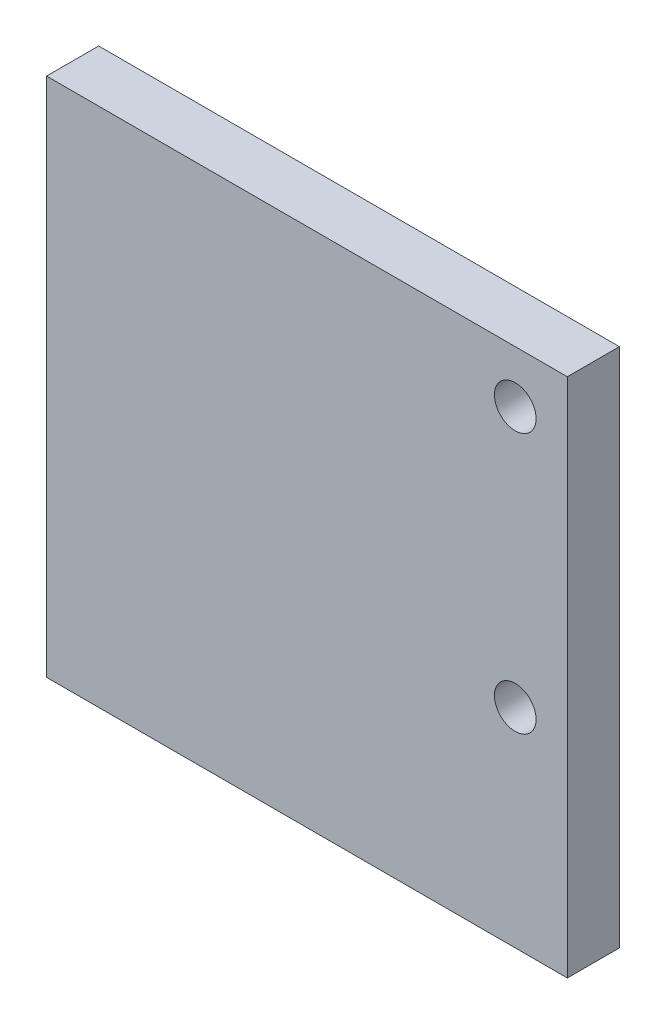
ISO-10303-21;
HEADER;
FILE_DESCRIPTION(('STEP AP214'),'2;1');
FILE_NAME('part.step','',(''),(''),'','','');
FILE_SCHEMA(('AUTOMOTIVE_DESIGN { 1 0 10303 214 1 1 1 1 }'));
ENDSEC;
DATA;
#1=APPLICATION_CONTEXT('core data for automotive mechanical design processes');
#2=APPLICATION_PROTOCOL_DEFINITION('international standard','automotive_design',2000,#1);
#3=PRODUCT_CONTEXT('',#1,'mechanical');
#4=PRODUCT('Part','Part','',(#3));
#5=PRODUCT_RELATED_PRODUCT_CATEGORY('part','',(#4));
#6=PRODUCT_DEFINITION_FORMATION('','',#4);
#7=PRODUCT_DEFINITION_CONTEXT('part definition',#1,'design');
#8=PRODUCT_DEFINITION('design','',#6,#7);
#9=PRODUCT_DEFINITION_SHAPE('','',#8);
#10=(LENGTH_UNIT() NAMED_UNIT(*) SI_UNIT(.MILLI.,.METRE.));
#11=(NAMED_UNIT(*) PLANE_ANGLE_UNIT() SI_UNIT($,.RADIAN.));
#12=(NAMED_UNIT(*) SI_UNIT($,.STERADIAN.) SOLID_ANGLE_UNIT());
#13=UNCERTAINTY_MEASURE_WITH_UNIT(LENGTH_MEASURE(1.E-05),#10,'distance_accuracy_value','');
#14=(GEOMETRIC_REPRESENTATION_CONTEXT(3) GLOBAL_UNCERTAINTY_ASSIGNED_CONTEXT((#13)) GLOBAL_UNIT_ASSIGNED_CONTEXT((#10,
#11,#12)) REPRESENTATION_CONTEXT('',''));
#15=CARTESIAN_POINT('',(0.,0.,0.));
#16=DIRECTION('',(0.,0.,1.));
#17=DIRECTION('',(1.,0.,0.));
#18=AXIS2_PLACEMENT_3D('',#15,#16,#17);
#19=CARTESIAN_POINT('',(0.,0.,10.));
#20=DIRECTION('',(1.,0.,0.));
#21=DIRECTION('',(0.,1.,0.));
#22=AXIS2_PLACEMENT_3D('',#19,#20,#21);
#23=PLANE('',#22);
#24=DIRECTION('',(0.,-1.,0.));
#25=VECTOR('',#24,1.);
#26=CARTESIAN_POINT('',(0.,0.,0.));
#27=LINE('',#26,#25);
#28=CARTESIAN_POINT('',(0.,100.,0.));
#29=VERTEX_POINT('',#28);
#30=CARTESIAN_POINT('',(0.,0.,0.));
#31=VERTEX_POINT('',#30);
#32=EDGE_CURVE('E95',#29,#31,#27,.T.);
#33=ORIENTED_EDGE('',*,*,#32,.T.);
#34=DIRECTION('',(0.,0.,-1.));
#35=VECTOR('',#34,1.);
#36=CARTESIAN_POINT('',(0.,0.,10.));
#37=LINE('',#36,#35);
#38=CARTESIAN_POINT('',(0.,0.,10.));
#39=VERTEX_POINT('',#38);
#40=EDGE_CURVE('E11',#39,#31,#37,.T.);
#41=ORIENTED_EDGE('',*,*,#40,.F.);
#42=DIRECTION('',(0.,-1.,0.));
#43=VECTOR('',#42,1.);
#44=CARTESIAN_POINT('',(0.,0.,10.));
#45=LINE('',#44,#43);
#46=CARTESIAN_POINT('',(0.,100.,10.));
#47=VERTEX_POINT('',#46);
#48=EDGE_CURVE('E83',#47,#39,#45,.T.);
#49=ORIENTED_EDGE('',*,*,#48,.F.);
#50=DIRECTION('',(0.,0.,-1.));
#51=VECTOR('',#50,1.);
#52=CARTESIAN_POINT('',(0.,100.,10.));
#53=LINE('',#52,#51);
#54=EDGE_CURVE('E91',#47,#29,#53,.T.);
#55=ORIENTED_EDGE('',*,*,#54,.T.);
#56=EDGE_LOOP('',(#33,#41,#49,#55));
#57=FACE_BOUND('',#56,.T.);
#58=ADVANCED_FACE('F32',(#57),#23,.F.);
#59=CARTESIAN_POINT('',(0.,0.,10.));
#60=DIRECTION('',(0.,1.,0.));
#61=DIRECTION('',(0.,0.,1.));
#62=AXIS2_PLACEMENT_3D('',#59,#60,#61);
#63=PLANE('',#62);
#64=CARTESIAN_POINT('',(25.,0.,5.));
#65=DIRECTION('',(0.,-1.,0.));
#66=DIRECTION('',(0.,0.,-1.));
#67=AXIS2_PLACEMENT_3D('',#64,#65,#66);
#68=CIRCLE('',#67,2.5);
#69=CARTESIAN_POINT('',(25.,0.,2.5));
#70=VERTEX_POINT('',#69);
#71=EDGE_CURVE('E122',#70,#70,#68,.T.);
#72=ORIENTED_EDGE('',*,*,#71,.F.);
#73=EDGE_LOOP('',(#72));
#74=FACE_BOUND('',#73,.T.);
#75=CARTESIAN_POINT('',(50.,0.,5.));
#76=DIRECTION('',(0.,-1.,0.));
#77=DIRECTION('',(0.,0.,-1.));
#78=AXIS2_PLACEMENT_3D('',#75,#76,#77);
#79=CIRCLE('',#78,2.5);
#80=CARTESIAN_POINT('',(50.,0.,2.5));
#81=VERTEX_POINT('',#80);
#82=EDGE_CURVE('E116',#81,#81,#79,.T.);
#83=ORIENTED_EDGE('',*,*,#82,.F.);
#84=EDGE_LOOP('',(#83));
#85=FACE_BOUND('',#84,.T.);
#86=CARTESIAN_POINT('',(75.,0.,5.));
#87=DIRECTION('',(0.,-1.,0.));
#88=DIRECTION('',(0.,0.,-1.));
#89=AXIS2_PLACEMENT_3D('',#86,#87,#88);
#90=CIRCLE('',#89,2.5);
#91=CARTESIAN_POINT('',(75.,0.,2.5));
#92=VERTEX_POINT('',#91);
#93=EDGE_CURVE('E109',#92,#92,#90,.T.);
#94=ORIENTED_EDGE('',*,*,#93,.F.);
#95=EDGE_LOOP('',(#94));
#96=FACE_BOUND('',#95,.T.);
#97=DIRECTION('',(1.,0.,0.));
#98=VECTOR('',#97,1.);
#99=CARTESIAN_POINT('',(0.,0.,0.));
#100=LINE('',#99,#98);
#101=CARTESIAN_POINT('',(100.,0.,0.));
#102=VERTEX_POINT('',#101);
#103=EDGE_CURVE('E87',#31,#102,#100,.T.);
#104=ORIENTED_EDGE('',*,*,#103,.T.);
#105=DIRECTION('',(0.,0.,-1.));
#106=VECTOR('',#105,1.);
#107=CARTESIAN_POINT('',(100.,0.,10.));
#108=LINE('',#107,#106);
#109=CARTESIAN_POINT('',(100.,0.,10.));
#110=VERTEX_POINT('',#109);
#111=EDGE_CURVE('E40',#110,#102,#108,.T.);
#112=ORIENTED_EDGE('',*,*,#111,.F.);
#113=DIRECTION('',(1.,0.,0.));
#114=VECTOR('',#113,1.);
#115=CARTESIAN_POINT('',(0.,0.,10.));
#116=LINE('',#115,#114);
#117=EDGE_CURVE('E78',#39,#110,#116,.T.);
#118=ORIENTED_EDGE('',*,*,#117,.F.);
#119=ORIENTED_EDGE('',*,*,#40,.T.);
#120=EDGE_LOOP('',(#104,#112,#118,#119));
#121=FACE_BOUND('',#120,.T.);
#122=ADVANCED_FACE('F86',(#74,#85,#96,#121),#63,.F.);
#123=CARTESIAN_POINT('',(100.,0.,10.));
#124=DIRECTION('',(-1.,0.,0.));
#125=DIRECTION('',(0.,-1.,0.));
#126=AXIS2_PLACEMENT_3D('',#123,#124,#125);
#127=PLANE('',#126);
#128=DIRECTION('',(0.,1.,0.));
#129=VECTOR('',#128,1.);
#130=CARTESIAN_POINT('',(100.,0.,0.));
#131=LINE('',#130,#129);
#132=CARTESIAN_POINT('',(100.,100.,0.));
#133=VERTEX_POINT('',#132);
#134=EDGE_CURVE('E65',#102,#133,#131,.T.);
#135=ORIENTED_EDGE('',*,*,#134,.T.);
#136=DIRECTION('',(0.,0.,-1.));
#137=VECTOR('',#136,1.);
#138=CARTESIAN_POINT('',(100.,100.,10.));
#139=LINE('',#138,#137);
#140=CARTESIAN_POINT('',(100.,100.,10.));
#141=VERTEX_POINT('',#140);
#142=EDGE_CURVE('E88',#141,#133,#139,.T.);
#143=ORIENTED_EDGE('',*,*,#142,.F.);
#144=DIRECTION('',(0.,1.,0.));
#145=VECTOR('',#144,1.);
#146=CARTESIAN_POINT('',(100.,0.,10.));
#147=LINE('',#146,#145);
#148=EDGE_CURVE('E81',#110,#141,#147,.T.);
#149=ORIENTED_EDGE('',*,*,#148,.F.);
#150=ORIENTED_EDGE('',*,*,#111,.T.);
#151=EDGE_LOOP('',(#135,#143,#149,#150));
#152=FACE_BOUND('',#151,.T.);
#153=ADVANCED_FACE('F89',(#152),#127,.F.);
#154=CARTESIAN_POINT('',(0.,100.,10.));
#155=DIRECTION('',(0.,-1.,0.));
#156=DIRECTION('',(0.,0.,-1.));
#157=AXIS2_PLACEMENT_3D('',#154,#155,#156);
#158=PLANE('',#157);
#159=DIRECTION('',(-1.,0.,0.));
#160=VECTOR('',#159,1.);
#161=CARTESIAN_POINT('',(0.,100.,0.));
#162=LINE('',#161,#160);
#163=EDGE_CURVE('E71',#133,#29,#162,.T.);
#164=ORIENTED_EDGE('',*,*,#163,.T.);
#165=ORIENTED_EDGE('',*,*,#54,.F.);
#166=DIRECTION('',(-1.,0.,0.));
#167=VECTOR('',#166,1.);
#168=CARTESIAN_POINT('',(0.,100.,10.));
#169=LINE('',#168,#167);
#170=EDGE_CURVE('E48',#141,#47,#169,.T.);
#171=ORIENTED_EDGE('',*,*,#170,.F.);
#172=ORIENTED_EDGE('',*,*,#142,.T.);
#173=EDGE_LOOP('',(#164,#165,#171,#172));
#174=FACE_BOUND('',#173,.T.);
#175=ADVANCED_FACE('F103',(#174),#158,.F.);
#176=CARTESIAN_POINT('',(0.,0.,10.));
#177=DIRECTION('',(0.,0.,-1.));
#178=DIRECTION('',(-1.,0.,0.));
#179=AXIS2_PLACEMENT_3D('',#176,#177,#178);
#180=PLANE('',#179);
#181=CARTESIAN_POINT('',(90.,90.,10.));
#182=DIRECTION('',(0.,0.,1.));
#183=DIRECTION('',(1.,0.,0.));
#184=AXIS2_PLACEMENT_3D('',#181,#182,#183);
#185=CIRCLE('',#184,4.00000000000001);
#186=CARTESIAN_POINT('',(94.,90.,10.));
#187=VERTEX_POINT('',#186);
#188=EDGE_CURVE('E133',#187,#187,#185,.T.);
#189=ORIENTED_EDGE('',*,*,#188,.F.);
#190=EDGE_LOOP('',(#189));
#191=FACE_BOUND('',#190,.T.);
#192=CARTESIAN_POINT('',(90.,40.,10.));
#193=DIRECTION('',(0.,0.,1.));
#194=DIRECTION('',(1.,0.,0.));
#195=AXIS2_PLACEMENT_3D('',#192,#193,#194);
#196=CIRCLE('',#195,4.00000000000001);
#197=CARTESIAN_POINT('',(94.,40.,10.));
#198=VERTEX_POINT('',#197);
#199=EDGE_CURVE('E127',#198,#198,#196,.T.);
#200=ORIENTED_EDGE('',*,*,#199,.F.);
#201=EDGE_LOOP('',(#200));
#202=FACE_BOUND('',#201,.T.);
#203=ORIENTED_EDGE('',*,*,#48,.T.);
#204=ORIENTED_EDGE('',*,*,#117,.T.);
#205=ORIENTED_EDGE('',*,*,#148,.T.);
#206=ORIENTED_EDGE('',*,*,#170,.T.);
#207=EDGE_LOOP('',(#203,#204,#205,#206));
#208=FACE_BOUND('',#207,.T.);
#209=ADVANCED_FACE('F79',(#191,#202,#208),#180,.F.);
#210=CARTESIAN_POINT('',(0.,0.,0.));
#211=DIRECTION('',(0.,0.,-1.));
#212=DIRECTION('',(-1.,0.,0.));
#213=AXIS2_PLACEMENT_3D('',#210,#211,#212);
#214=PLANE('',#213);
#215=CARTESIAN_POINT('',(90.,90.,0.));
#216=DIRECTION('',(0.,0.,1.));
#217=DIRECTION('',(1.,0.,0.));
#218=AXIS2_PLACEMENT_3D('',#215,#216,#217);
#219=CIRCLE('',#218,4.00000000000001);
#220=CARTESIAN_POINT('',(94.,90.,0.));
#221=VERTEX_POINT('',#220);
#222=EDGE_CURVE('E113',#221,#221,#219,.T.);
#223=ORIENTED_EDGE('',*,*,#222,.T.);
#224=EDGE_LOOP('',(#223));
#225=FACE_BOUND('',#224,.T.);
#226=CARTESIAN_POINT('',(90.,40.,0.));
#227=DIRECTION('',(0.,0.,1.));
#228=DIRECTION('',(1.,0.,0.));
#229=AXIS2_PLACEMENT_3D('',#226,#227,#228);
#230=CIRCLE('',#229,4.00000000000001);
#231=CARTESIAN_POINT('',(94.,40.,0.));
#232=VERTEX_POINT('',#231);
#233=EDGE_CURVE('E130',#232,#232,#230,.T.);
#234=ORIENTED_EDGE('',*,*,#233,.T.);
#235=EDGE_LOOP('',(#234));
#236=FACE_BOUND('',#235,.T.);
#237=ORIENTED_EDGE('',*,*,#32,.F.);
#238=ORIENTED_EDGE('',*,*,#163,.F.);
#239=ORIENTED_EDGE('',*,*,#134,.F.);
#240=ORIENTED_EDGE('',*,*,#103,.F.);
#241=EDGE_LOOP('',(#237,#238,#239,#240));
#242=FACE_BOUND('',#241,.T.);
#243=ADVANCED_FACE('F106',(#225,#236,#242),#214,.T.);
#244=CARTESIAN_POINT('',(75.,30.,5.));
#245=DIRECTION('',(0.,-1.,0.));
#246=DIRECTION('',(0.,0.,-1.));
#247=AXIS2_PLACEMENT_3D('',#244,#245,#246);
#248=CYLINDRICAL_SURFACE('',#247,2.5);
#249=CARTESIAN_POINT('',(75.,30.,5.));
#250=DIRECTION('',(0.,-1.,0.));
#251=DIRECTION('',(0.,0.,-1.));
#252=AXIS2_PLACEMENT_3D('',#249,#250,#251);
#253=CIRCLE('',#252,2.5);
#254=CARTESIAN_POINT('',(75.,30.,2.5));
#255=VERTEX_POINT('',#254);
#256=EDGE_CURVE('E112',#255,#255,#253,.T.);
#257=ORIENTED_EDGE('',*,*,#256,.F.);
#258=EDGE_LOOP('',(#257));
#259=FACE_BOUND('',#258,.T.);
#260=ORIENTED_EDGE('',*,*,#93,.T.);
#261=EDGE_LOOP('',(#260));
#262=FACE_BOUND('',#261,.T.);
#263=ADVANCED_FACE('F179',(#259,#262),#248,.F.);
#264=CARTESIAN_POINT('',(75.,30.,5.));
#265=DIRECTION('',(0.,-1.,0.));
#266=DIRECTION('',(0.,0.,-1.));
#267=AXIS2_PLACEMENT_3D('',#264,#265,#266);
#268=PLANE('',#267);
#269=ORIENTED_EDGE('',*,*,#256,.T.);
#270=EDGE_LOOP('',(#269));
#271=FACE_BOUND('',#270,.T.);
#272=ADVANCED_FACE('F183',(#271),#268,.T.);
#273=CARTESIAN_POINT('',(50.,30.,5.));
#274=DIRECTION('',(0.,-1.,0.));
#275=DIRECTION('',(0.,0.,-1.));
#276=AXIS2_PLACEMENT_3D('',#273,#274,#275);
#277=CYLINDRICAL_SURFACE('',#276,2.5);
#278=CARTESIAN_POINT('',(50.,30.,5.));
#279=DIRECTION('',(0.,-1.,0.));
#280=DIRECTION('',(0.,0.,-1.));
#281=AXIS2_PLACEMENT_3D('',#278,#279,#280);
#282=CIRCLE('',#281,2.5);
#283=CARTESIAN_POINT('',(50.,30.,2.5));
#284=VERTEX_POINT('',#283);
#285=EDGE_CURVE('E119',#284,#284,#282,.T.);
#286=ORIENTED_EDGE('',*,*,#285,.F.);
#287=EDGE_LOOP('',(#286));
#288=FACE_BOUND('',#287,.T.);
#289=ORIENTED_EDGE('',*,*,#82,.T.);
#290=EDGE_LOOP('',(#289));
#291=FACE_BOUND('',#290,.T.);
#292=ADVANCED_FACE('F187',(#288,#291),#277,.F.);
#293=CARTESIAN_POINT('',(50.,30.,5.));
#294=DIRECTION('',(0.,-1.,0.));
#295=DIRECTION('',(0.,0.,-1.));
#296=AXIS2_PLACEMENT_3D('',#293,#294,#295);
#297=PLANE('',#296);
#298=ORIENTED_EDGE('',*,*,#285,.T.);
#299=EDGE_LOOP('',(#298));
#300=FACE_BOUND('',#299,.T.);
#301=ADVANCED_FACE('F191',(#300),#297,.T.);
#302=CARTESIAN_POINT('',(25.,30.,5.));
#303=DIRECTION('',(0.,-1.,0.));
#304=DIRECTION('',(0.,0.,-1.));
#305=AXIS2_PLACEMENT_3D('',#302,#303,#304);
#306=CYLINDRICAL_SURFACE('',#305,2.5);
#307=CARTESIAN_POINT('',(25.,30.,5.));
#308=DIRECTION('',(0.,-1.,0.));
#309=DIRECTION('',(0.,0.,-1.));
#310=AXIS2_PLACEMENT_3D('',#307,#308,#309);
#311=CIRCLE('',#310,2.5);
#312=CARTESIAN_POINT('',(25.,30.,2.5));
#313=VERTEX_POINT('',#312);
#314=EDGE_CURVE('E98',#313,#313,#311,.T.);
#315=ORIENTED_EDGE('',*,*,#314,.F.);
#316=EDGE_LOOP('',(#315));
#317=FACE_BOUND('',#316,.T.);
#318=ORIENTED_EDGE('',*,*,#71,.T.);
#319=EDGE_LOOP('',(#318));
#320=FACE_BOUND('',#319,.T.);
#321=ADVANCED_FACE('F160',(#317,#320),#306,.F.);
#322=CARTESIAN_POINT('',(25.,30.,5.));
#323=DIRECTION('',(0.,-1.,0.));
#324=DIRECTION('',(0.,0.,-1.));
#325=AXIS2_PLACEMENT_3D('',#322,#323,#324);
#326=PLANE('',#325);
#327=ORIENTED_EDGE('',*,*,#314,.T.);
#328=EDGE_LOOP('',(#327));
#329=FACE_BOUND('',#328,.T.);
#330=ADVANCED_FACE('F154',(#329),#326,.T.);
#331=CARTESIAN_POINT('',(90.,40.,0.));
#332=DIRECTION('',(0.,0.,1.));
#333=DIRECTION('',(1.,0.,0.));
#334=AXIS2_PLACEMENT_3D('',#331,#332,#333);
#335=CYLINDRICAL_SURFACE('',#334,4.00000000000001);
#336=ORIENTED_EDGE('',*,*,#233,.F.);
#337=EDGE_LOOP('',(#336));
#338=FACE_BOUND('',#337,.T.);
#339=ORIENTED_EDGE('',*,*,#199,.T.);
#340=EDGE_LOOP('',(#339));
#341=FACE_BOUND('',#340,.T.);
#342=ADVANCED_FACE('F144',(#338,#341),#335,.F.);
#343=CARTESIAN_POINT('',(90.,90.,0.));
#344=DIRECTION('',(0.,0.,1.));
#345=DIRECTION('',(1.,0.,0.));
#346=AXIS2_PLACEMENT_3D('',#343,#344,#345);
#347=CYLINDRICAL_SURFACE('',#346,4.00000000000001);
#348=ORIENTED_EDGE('',*,*,#222,.F.);
#349=EDGE_LOOP('',(#348));
#350=FACE_BOUND('',#349,.T.);
#351=ORIENTED_EDGE('',*,*,#188,.T.);
#352=EDGE_LOOP('',(#351));
#353=FACE_BOUND('',#352,.T.);
#354=ADVANCED_FACE('F141',(#350,#353),#347,.F.);
#355=CLOSED_SHELL('',(#58,#122,#153,#175,#209,#243,#263,#272,#292,#301,#321,#330,#342,#354));
#356=MANIFOLD_SOLID_BREP('B2',#355);
#357=ADVANCED_BREP_SHAPE_REPRESENTATION('',(#18,#356),#14);
#358=SHAPE_DEFINITION_REPRESENTATION(#9,#357);
ENDSEC;
END-ISO-10303-21;
